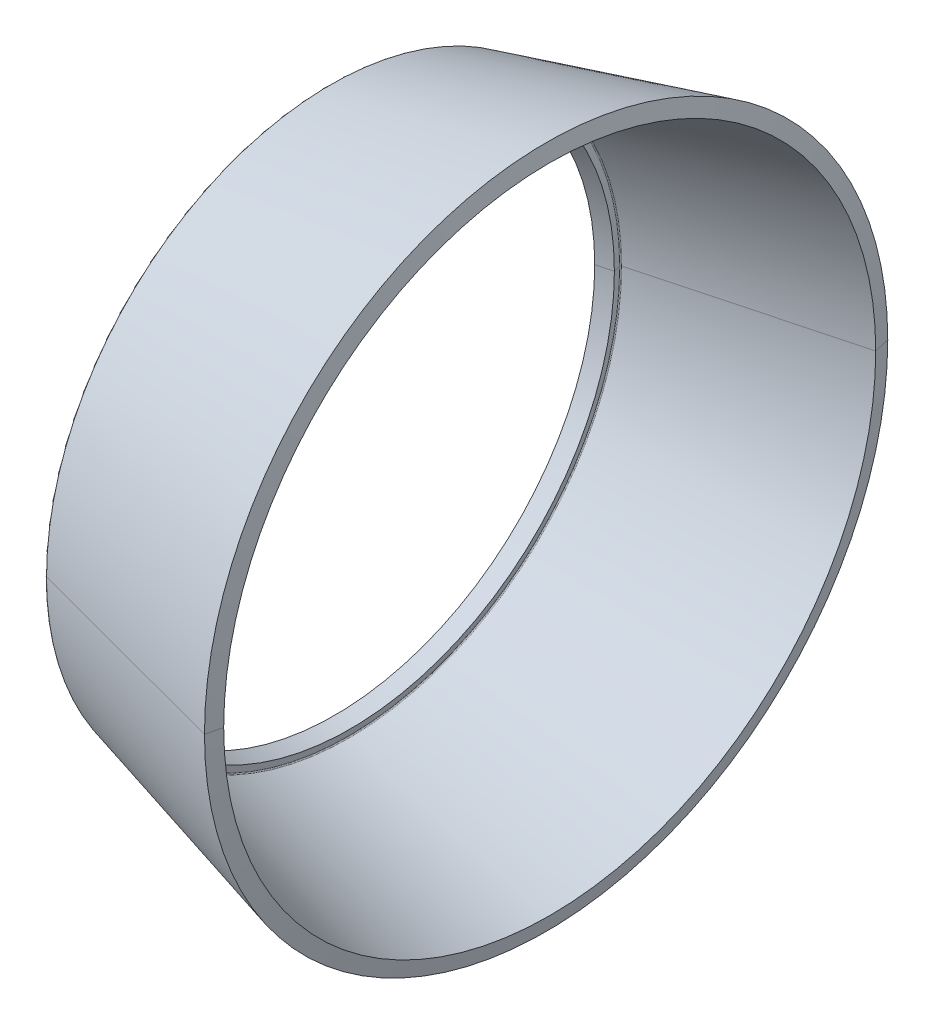
ISO-10303-21;
HEADER;
FILE_DESCRIPTION(('STEP AP214'),'2;1');
FILE_NAME('part.step','',(''),(''),'','','');
FILE_SCHEMA(('AUTOMOTIVE_DESIGN { 1 0 10303 214 1 1 1 1 }'));
ENDSEC;
DATA;
#1=APPLICATION_CONTEXT('core data for automotive mechanical design processes');
#2=APPLICATION_PROTOCOL_DEFINITION('international standard','automotive_design',2000,#1);
#3=PRODUCT_CONTEXT('',#1,'mechanical');
#4=PRODUCT('Part','Part','',(#3));
#5=PRODUCT_RELATED_PRODUCT_CATEGORY('part','',(#4));
#6=PRODUCT_DEFINITION_FORMATION('','',#4);
#7=PRODUCT_DEFINITION_CONTEXT('part definition',#1,'design');
#8=PRODUCT_DEFINITION('design','',#6,#7);
#9=PRODUCT_DEFINITION_SHAPE('','',#8);
#10=(LENGTH_UNIT() NAMED_UNIT(*) SI_UNIT(.MILLI.,.METRE.));
#11=(NAMED_UNIT(*) PLANE_ANGLE_UNIT() SI_UNIT($,.RADIAN.));
#12=(NAMED_UNIT(*) SI_UNIT($,.STERADIAN.) SOLID_ANGLE_UNIT());
#13=UNCERTAINTY_MEASURE_WITH_UNIT(LENGTH_MEASURE(1.E-05),#10,'distance_accuracy_value','');
#14=(GEOMETRIC_REPRESENTATION_CONTEXT(3) GLOBAL_UNCERTAINTY_ASSIGNED_CONTEXT((#13)) GLOBAL_UNIT_ASSIGNED_CONTEXT((#10,
#11,#12)) REPRESENTATION_CONTEXT('',''));
#15=CARTESIAN_POINT('',(0.,0.,0.));
#16=DIRECTION('',(0.,0.,1.));
#17=DIRECTION('',(1.,0.,0.));
#18=AXIS2_PLACEMENT_3D('',#15,#16,#17);
#19=CARTESIAN_POINT('',(13.309426727243,0.,0.));
#20=DIRECTION('',(1.,0.,0.));
#21=DIRECTION('',(0.,1.,0.));
#22=AXIS2_PLACEMENT_3D('',#19,#20,#21);
#23=CONICAL_SURFACE('',#22,21.309747556316,0.261083802805841);
#24=DIRECTION('',(0.966110785991032,0.,0.258127776869888));
#25=VECTOR('',#24,1.);
#26=CARTESIAN_POINT('',(-0.131131806478413,0.,17.718667170395));
#27=LINE('',#26,#25);
#28=CARTESIAN_POINT('',(-0.131131806478413,0.,17.718667170395));
#29=VERTEX_POINT('',#28);
#30=CARTESIAN_POINT('',(13.309426727243,0.,21.309747556316));
#31=VERTEX_POINT('',#30);
#32=EDGE_CURVE('E11',#29,#31,#27,.T.);
#33=ORIENTED_EDGE('',*,*,#32,.F.);
#34=CARTESIAN_POINT('',(-0.131131806478411,0.,0.));
#35=DIRECTION('',(1.,0.,0.));
#36=DIRECTION('',(0.,0.,-1.));
#37=AXIS2_PLACEMENT_3D('',#34,#35,#36);
#38=CIRCLE('',#37,17.718667170395);
#39=CARTESIAN_POINT('',(-0.131131806478407,-16.8514538724692,-5.47536927332551));
#40=VERTEX_POINT('',#39);
#41=EDGE_CURVE('E25',#29,#40,#38,.T.);
#42=ORIENTED_EDGE('',*,*,#41,.T.);
#43=CARTESIAN_POINT('',(-0.131131806478411,0.,0.));
#44=DIRECTION('',(1.,0.,0.));
#45=DIRECTION('',(0.,0.,-1.));
#46=AXIS2_PLACEMENT_3D('',#43,#44,#45);
#47=CIRCLE('',#46,17.718667170395);
#48=CARTESIAN_POINT('',(-0.131131806478411,0.,-17.718667170395));
#49=VERTEX_POINT('',#48);
#50=EDGE_CURVE('E385',#40,#49,#47,.T.);
#51=ORIENTED_EDGE('',*,*,#50,.T.);
#52=DIRECTION('',(0.966110785991032,0.,-0.258127776869888));
#53=VECTOR('',#52,1.);
#54=CARTESIAN_POINT('',(-0.131131806478409,0.,-17.718667170395));
#55=LINE('',#54,#53);
#56=CARTESIAN_POINT('',(13.309426727243,0.,-21.309747556316));
#57=VERTEX_POINT('',#56);
#58=EDGE_CURVE('E125',#49,#57,#55,.T.);
#59=ORIENTED_EDGE('',*,*,#58,.T.);
#60=CARTESIAN_POINT('',(13.309426727243,0.,0.));
#61=DIRECTION('',(1.,0.,0.));
#62=DIRECTION('',(0.,0.,-1.));
#63=AXIS2_PLACEMENT_3D('',#60,#61,#62);
#64=CIRCLE('',#63,21.309747556316);
#65=EDGE_CURVE('E377',#31,#57,#64,.T.);
#66=ORIENTED_EDGE('',*,*,#65,.F.);
#67=EDGE_LOOP('',(#33,#42,#51,#59,#66));
#68=FACE_BOUND('',#67,.T.);
#69=ADVANCED_FACE('F17',(#68),#23,.T.);
#70=CARTESIAN_POINT('',(13.533715877423,0.,0.));
#71=DIRECTION('',(-1.,0.,0.));
#72=DIRECTION('',(0.,1.,0.));
#73=AXIS2_PLACEMENT_3D('',#70,#71,#72);
#74=CONICAL_SURFACE('',#73,20.334595685589,1.34472382878342);
#75=DIRECTION('',(-0.224151698358496,0.,-0.974554265355707));
#76=VECTOR('',#75,1.);
#77=CARTESIAN_POINT('',(13.533715877423,0.,-20.334595685589));
#78=LINE('',#77,#76);
#79=CARTESIAN_POINT('',(13.533715877423,0.,-20.334595685589));
#80=VERTEX_POINT('',#79);
#81=EDGE_CURVE('E372',#80,#57,#78,.T.);
#82=ORIENTED_EDGE('',*,*,#81,.F.);
#83=CARTESIAN_POINT('',(13.533715877423,0.,0.));
#84=DIRECTION('',(1.,0.,0.));
#85=DIRECTION('',(0.,0.,-1.));
#86=AXIS2_PLACEMENT_3D('',#83,#84,#85);
#87=CIRCLE('',#86,20.334595685589);
#88=CARTESIAN_POINT('',(13.533715877423,0.,20.334595685589));
#89=VERTEX_POINT('',#88);
#90=EDGE_CURVE('E367',#89,#80,#87,.T.);
#91=ORIENTED_EDGE('',*,*,#90,.F.);
#92=DIRECTION('',(-0.224151698358495,0.,0.974554265355707));
#93=VECTOR('',#92,1.);
#94=CARTESIAN_POINT('',(13.533715877423,0.,20.334595685589));
#95=LINE('',#94,#93);
#96=EDGE_CURVE('E362',#89,#31,#95,.T.);
#97=ORIENTED_EDGE('',*,*,#96,.T.);
#98=ORIENTED_EDGE('',*,*,#65,.T.);
#99=EDGE_LOOP('',(#82,#91,#97,#98));
#100=FACE_BOUND('',#99,.T.);
#101=ADVANCED_FACE('F426',(#100),#74,.T.);
#102=CARTESIAN_POINT('',(13.533715877423,0.,0.));
#103=DIRECTION('',(-1.,0.,0.));
#104=DIRECTION('',(0.,-1.,0.));
#105=AXIS2_PLACEMENT_3D('',#102,#103,#104);
#106=CONICAL_SURFACE('',#105,20.334595685589,1.34472382878342);
#107=ORIENTED_EDGE('',*,*,#81,.T.);
#108=CARTESIAN_POINT('',(13.309426727243,0.,0.));
#109=DIRECTION('',(1.,0.,0.));
#110=DIRECTION('',(0.,0.,-1.));
#111=AXIS2_PLACEMENT_3D('',#108,#109,#110);
#112=CIRCLE('',#111,21.309747556316);
#113=EDGE_CURVE('E357',#57,#31,#112,.T.);
#114=ORIENTED_EDGE('',*,*,#113,.T.);
#115=ORIENTED_EDGE('',*,*,#96,.F.);
#116=CARTESIAN_POINT('',(13.533715877423,0.,0.));
#117=DIRECTION('',(1.,0.,0.));
#118=DIRECTION('',(0.,0.,-1.));
#119=AXIS2_PLACEMENT_3D('',#116,#117,#118);
#120=CIRCLE('',#119,20.334595685589);
#121=EDGE_CURVE('E352',#80,#89,#120,.T.);
#122=ORIENTED_EDGE('',*,*,#121,.F.);
#123=EDGE_LOOP('',(#107,#114,#115,#122));
#124=FACE_BOUND('',#123,.T.);
#125=ADVANCED_FACE('F430',(#124),#106,.T.);
#126=CARTESIAN_POINT('',(1.0287650712105,0.,0.));
#127=DIRECTION('',(1.,0.,0.));
#128=DIRECTION('',(0.,-1.,0.));
#129=AXIS2_PLACEMENT_3D('',#126,#127,#128);
#130=CONICAL_SURFACE('',#129,16.993493196848,0.261083802805781);
#131=DIRECTION('',(0.966110785991047,0.,0.25812777686983));
#132=VECTOR('',#131,1.);
#133=CARTESIAN_POINT('',(1.0287650712105,0.,16.993493196848));
#134=LINE('',#133,#132);
#135=CARTESIAN_POINT('',(1.0287650712105,0.,16.993493196848));
#136=VERTEX_POINT('',#135);
#137=EDGE_CURVE('E340',#136,#89,#134,.T.);
#138=ORIENTED_EDGE('',*,*,#137,.F.);
#139=CARTESIAN_POINT('',(1.0287650712105,0.,0.));
#140=DIRECTION('',(1.,0.,0.));
#141=DIRECTION('',(0.,0.,-1.));
#142=AXIS2_PLACEMENT_3D('',#139,#140,#141);
#143=CIRCLE('',#142,16.993493196848);
#144=CARTESIAN_POINT('',(1.0287650712105,16.1617724394797,5.25127819162109));
#145=VERTEX_POINT('',#144);
#146=EDGE_CURVE('E337',#145,#136,#143,.T.);
#147=ORIENTED_EDGE('',*,*,#146,.F.);
#148=CARTESIAN_POINT('',(1.0287650712105,0.,0.));
#149=DIRECTION('',(1.,0.,0.));
#150=DIRECTION('',(0.,0.,-1.));
#151=AXIS2_PLACEMENT_3D('',#148,#149,#150);
#152=CIRCLE('',#151,16.993493196848);
#153=CARTESIAN_POINT('',(1.0287650712105,0.,-16.993493196848));
#154=VERTEX_POINT('',#153);
#155=EDGE_CURVE('E330',#154,#145,#152,.T.);
#156=ORIENTED_EDGE('',*,*,#155,.F.);
#157=DIRECTION('',(0.966110785991047,0.,-0.25812777686983));
#158=VECTOR('',#157,1.);
#159=CARTESIAN_POINT('',(1.0287650712105,0.,-16.993493196848));
#160=LINE('',#159,#158);
#161=EDGE_CURVE('E338',#154,#80,#160,.T.);
#162=ORIENTED_EDGE('',*,*,#161,.T.);
#163=ORIENTED_EDGE('',*,*,#121,.T.);
#164=EDGE_LOOP('',(#138,#147,#156,#162,#163));
#165=FACE_BOUND('',#164,.T.);
#166=ADVANCED_FACE('F435',(#165),#130,.F.);
#167=CARTESIAN_POINT('',(1.0287650712105,0.,0.));
#168=DIRECTION('',(1.,0.,0.));
#169=DIRECTION('',(0.,1.,0.));
#170=AXIS2_PLACEMENT_3D('',#167,#168,#169);
#171=CONICAL_SURFACE('',#170,16.993493196848,0.261083802805781);
#172=ORIENTED_EDGE('',*,*,#137,.T.);
#173=ORIENTED_EDGE('',*,*,#90,.T.);
#174=ORIENTED_EDGE('',*,*,#161,.F.);
#175=CARTESIAN_POINT('',(1.0287650712105,0.,0.));
#176=DIRECTION('',(1.,0.,0.));
#177=DIRECTION('',(0.,0.,-1.));
#178=AXIS2_PLACEMENT_3D('',#175,#176,#177);
#179=CIRCLE('',#178,16.993493196848);
#180=CARTESIAN_POINT('',(1.0287650712105,-16.1617724394797,-5.25127819162109));
#181=VERTEX_POINT('',#180);
#182=EDGE_CURVE('E333',#181,#154,#179,.T.);
#183=ORIENTED_EDGE('',*,*,#182,.F.);
#184=CARTESIAN_POINT('',(1.0287650712105,0.,0.));
#185=DIRECTION('',(1.,0.,0.));
#186=DIRECTION('',(0.,0.,-1.));
#187=AXIS2_PLACEMENT_3D('',#184,#185,#186);
#188=CIRCLE('',#187,16.993493196848);
#189=EDGE_CURVE('E447',#136,#181,#188,.T.);
#190=ORIENTED_EDGE('',*,*,#189,.F.);
#191=EDGE_LOOP('',(#172,#173,#174,#183,#190));
#192=FACE_BOUND('',#191,.T.);
#193=ADVANCED_FACE('F301',(#192),#171,.F.);
#194=CARTESIAN_POINT('',(1.04597358966921,0.,0.));
#195=DIRECTION('',(1.,0.,0.));
#196=DIRECTION('',(0.,0.309016994374947,-0.951056516295154));
#197=AXIS2_PLACEMENT_3D('',#194,#195,#196);
#198=TOROIDAL_SURFACE('',#197,16.9290858111148,0.0666666666673144);
#199=CARTESIAN_POINT('',(1.04597358966921,-16.1005173755806,-5.23137521486626));
#200=DIRECTION('',(0.,0.309016994374952,-0.951056516295152));
#201=DIRECTION('',(-0.258127776878198,-0.91882595847769,-0.298544651319485));
#202=AXIS2_PLACEMENT_3D('',#199,#200,#201);
#203=CIRCLE('',#202,0.0666666666673139);
#204=CARTESIAN_POINT('',(0.981003305311402,-16.0863053133568,-5.22675743592568));
#205=VERTEX_POINT('',#204);
#206=EDGE_CURVE('E448',#181,#205,#203,.T.);
#207=ORIENTED_EDGE('',*,*,#206,.T.);
#208=CARTESIAN_POINT('',(0.981003305311402,0.,0.));
#209=DIRECTION('',(1.,0.,0.));
#210=DIRECTION('',(0.,0.,1.));
#211=AXIS2_PLACEMENT_3D('',#208,#209,#210);
#212=CIRCLE('',#211,16.914142364558);
#213=CARTESIAN_POINT('',(0.981003305311402,0.,16.914142364558));
#214=VERTEX_POINT('',#213);
#215=EDGE_CURVE('E267',#214,#205,#212,.T.);
#216=ORIENTED_EDGE('',*,*,#215,.F.);
#217=CARTESIAN_POINT('',(0.981003305311402,0.,0.));
#218=DIRECTION('',(1.,0.,0.));
#219=DIRECTION('',(0.,0.951056516295156,0.309016994374939));
#220=AXIS2_PLACEMENT_3D('',#217,#218,#219);
#221=CIRCLE('',#220,16.914142364558);
#222=CARTESIAN_POINT('',(0.981003305311402,16.0863053133568,5.22675743592568));
#223=VERTEX_POINT('',#222);
#224=EDGE_CURVE('E242',#223,#214,#221,.T.);
#225=ORIENTED_EDGE('',*,*,#224,.F.);
#226=CARTESIAN_POINT('',(1.04597358966921,16.1005173755806,5.23137521486626));
#227=DIRECTION('',(0.,-0.309016994374952,0.951056516295152));
#228=DIRECTION('',(-0.258127776878195,0.918825958477691,0.298544651319485));
#229=AXIS2_PLACEMENT_3D('',#226,#227,#228);
#230=CIRCLE('',#229,0.0666666666673139);
#231=EDGE_CURVE('E324',#145,#223,#230,.T.);
#232=ORIENTED_EDGE('',*,*,#231,.F.);
#233=ORIENTED_EDGE('',*,*,#146,.T.);
#234=ORIENTED_EDGE('',*,*,#189,.T.);
#235=EDGE_LOOP('',(#207,#216,#225,#232,#233,#234));
#236=FACE_BOUND('',#235,.T.);
#237=ADVANCED_FACE('F296',(#236),#198,.F.);
#238=CARTESIAN_POINT('',(1.04597358966921,0.,0.));
#239=DIRECTION('',(1.,0.,0.));
#240=DIRECTION('',(0.,-0.309016994374947,0.951056516295154));
#241=AXIS2_PLACEMENT_3D('',#238,#239,#240);
#242=TOROIDAL_SURFACE('',#241,16.9290858111148,0.0666666666673144);
#243=ORIENTED_EDGE('',*,*,#206,.F.);
#244=ORIENTED_EDGE('',*,*,#182,.T.);
#245=ORIENTED_EDGE('',*,*,#155,.T.);
#246=ORIENTED_EDGE('',*,*,#231,.T.);
#247=CARTESIAN_POINT('',(0.981003305311402,0.,0.));
#248=DIRECTION('',(1.,0.,0.));
#249=DIRECTION('',(0.,0.,-1.));
#250=AXIS2_PLACEMENT_3D('',#247,#248,#249);
#251=CIRCLE('',#250,16.914142364558);
#252=CARTESIAN_POINT('',(0.981003305311402,0.,-16.914142364558));
#253=VERTEX_POINT('',#252);
#254=EDGE_CURVE('E326',#253,#223,#251,.T.);
#255=ORIENTED_EDGE('',*,*,#254,.F.);
#256=CARTESIAN_POINT('',(0.981003305311402,0.,0.));
#257=DIRECTION('',(1.,0.,0.));
#258=DIRECTION('',(0.,-0.951056516295153,-0.30901699437495));
#259=AXIS2_PLACEMENT_3D('',#256,#257,#258);
#260=CIRCLE('',#259,16.914142364558);
#261=EDGE_CURVE('E256',#205,#253,#260,.T.);
#262=ORIENTED_EDGE('',*,*,#261,.F.);
#263=EDGE_LOOP('',(#243,#244,#245,#246,#255,#262));
#264=FACE_BOUND('',#263,.T.);
#265=ADVANCED_FACE('F287',(#264),#242,.F.);
#266=CARTESIAN_POINT('',(1.0787186738298,0.,0.));
#267=DIRECTION('',(-1.,0.,0.));
#268=DIRECTION('',(0.,1.,0.));
#269=AXIS2_PLACEMENT_3D('',#266,#267,#268);
#270=CONICAL_SURFACE('',#269,16.489300929592,1.34472382878407);
#271=DIRECTION('',(-0.224151698357865,0.,-0.974554265355852));
#272=VECTOR('',#271,1.);
#273=CARTESIAN_POINT('',(1.0787186738298,0.,-16.489300929592));
#274=LINE('',#273,#272);
#275=CARTESIAN_POINT('',(1.0787186738298,0.,-16.489300929592));
#276=VERTEX_POINT('',#275);
#277=EDGE_CURVE('E276',#276,#253,#274,.T.);
#278=ORIENTED_EDGE('',*,*,#277,.F.);
#279=CARTESIAN_POINT('',(1.0787186738298,0.,0.));
#280=DIRECTION('',(1.,0.,0.));
#281=DIRECTION('',(0.,0.,-1.));
#282=AXIS2_PLACEMENT_3D('',#279,#280,#281);
#283=CIRCLE('',#282,16.489300929592);
#284=CARTESIAN_POINT('',(1.0787186738298,0.,16.489300929592));
#285=VERTEX_POINT('',#284);
#286=EDGE_CURVE('E270',#285,#276,#283,.T.);
#287=ORIENTED_EDGE('',*,*,#286,.F.);
#288=DIRECTION('',(-0.224151698357865,0.,0.974554265355852));
#289=VECTOR('',#288,1.);
#290=CARTESIAN_POINT('',(1.0787186738298,0.,16.489300929592));
#291=LINE('',#290,#289);
#292=EDGE_CURVE('E268',#285,#214,#291,.T.);
#293=ORIENTED_EDGE('',*,*,#292,.T.);
#294=ORIENTED_EDGE('',*,*,#215,.T.);
#295=ORIENTED_EDGE('',*,*,#261,.T.);
#296=EDGE_LOOP('',(#278,#287,#293,#294,#295));
#297=FACE_BOUND('',#296,.T.);
#298=ADVANCED_FACE('F222',(#297),#270,.T.);
#299=CARTESIAN_POINT('',(1.0787186738298,0.,0.));
#300=DIRECTION('',(-1.,0.,0.));
#301=DIRECTION('',(0.,-1.,0.));
#302=AXIS2_PLACEMENT_3D('',#299,#300,#301);
#303=CONICAL_SURFACE('',#302,16.489300929592,1.34472382878407);
#304=ORIENTED_EDGE('',*,*,#277,.T.);
#305=ORIENTED_EDGE('',*,*,#254,.T.);
#306=ORIENTED_EDGE('',*,*,#224,.T.);
#307=ORIENTED_EDGE('',*,*,#292,.F.);
#308=CARTESIAN_POINT('',(1.0787186738298,0.,0.));
#309=DIRECTION('',(1.,0.,0.));
#310=DIRECTION('',(0.,0.,-1.));
#311=AXIS2_PLACEMENT_3D('',#308,#309,#310);
#312=CIRCLE('',#311,16.489300929592);
#313=EDGE_CURVE('E271',#276,#285,#312,.T.);
#314=ORIENTED_EDGE('',*,*,#313,.F.);
#315=EDGE_LOOP('',(#304,#305,#306,#307,#314));
#316=FACE_BOUND('',#315,.T.);
#317=ADVANCED_FACE('F217',(#316),#303,.T.);
#318=CARTESIAN_POINT('',(0.112015460084991,0.,0.));
#319=DIRECTION('',(1.,0.,0.));
#320=DIRECTION('',(0.,-1.,0.));
#321=AXIS2_PLACEMENT_3D('',#318,#319,#320);
#322=CONICAL_SURFACE('',#321,16.231014866466,0.261083802806108);
#323=DIRECTION('',(0.966110785990963,0.,0.258127776870145));
#324=VECTOR('',#323,1.);
#325=CARTESIAN_POINT('',(0.112015460084991,0.,16.231014866466));
#326=LINE('',#325,#324);
#327=CARTESIAN_POINT('',(0.112015460084993,0.,16.231014866466));
#328=VERTEX_POINT('',#327);
#329=EDGE_CURVE('E413',#328,#285,#326,.T.);
#330=ORIENTED_EDGE('',*,*,#329,.F.);
#331=CARTESIAN_POINT('',(0.112015460084991,0.,0.));
#332=DIRECTION('',(1.,0.,0.));
#333=DIRECTION('',(0.,0.,-1.));
#334=AXIS2_PLACEMENT_3D('',#331,#332,#333);
#335=CIRCLE('',#334,16.231014866466);
#336=CARTESIAN_POINT('',(0.112015460084991,0.,-16.231014866466));
#337=VERTEX_POINT('',#336);
#338=EDGE_CURVE('E408',#337,#328,#335,.T.);
#339=ORIENTED_EDGE('',*,*,#338,.F.);
#340=DIRECTION('',(0.966110785990963,0.,-0.258127776870145));
#341=VECTOR('',#340,1.);
#342=CARTESIAN_POINT('',(0.112015460084991,0.,-16.231014866466));
#343=LINE('',#342,#341);
#344=EDGE_CURVE('E399',#337,#276,#343,.T.);
#345=ORIENTED_EDGE('',*,*,#344,.T.);
#346=ORIENTED_EDGE('',*,*,#313,.T.);
#347=EDGE_LOOP('',(#330,#339,#345,#346));
#348=FACE_BOUND('',#347,.T.);
#349=ADVANCED_FACE('F213',(#348),#322,.F.);
#350=CARTESIAN_POINT('',(0.112015460084991,0.,0.));
#351=DIRECTION('',(1.,0.,0.));
#352=DIRECTION('',(0.,1.,0.));
#353=AXIS2_PLACEMENT_3D('',#350,#351,#352);
#354=CONICAL_SURFACE('',#353,16.231014866466,0.261083802806108);
#355=ORIENTED_EDGE('',*,*,#329,.T.);
#356=ORIENTED_EDGE('',*,*,#286,.T.);
#357=ORIENTED_EDGE('',*,*,#344,.F.);
#358=CARTESIAN_POINT('',(0.112015460084991,0.,0.));
#359=DIRECTION('',(1.,0.,0.));
#360=DIRECTION('',(0.,0.,-1.));
#361=AXIS2_PLACEMENT_3D('',#358,#359,#360);
#362=CIRCLE('',#361,16.231014866466);
#363=EDGE_CURVE('E398',#328,#337,#362,.T.);
#364=ORIENTED_EDGE('',*,*,#363,.F.);
#365=EDGE_LOOP('',(#355,#356,#357,#364));
#366=FACE_BOUND('',#365,.T.);
#367=ADVANCED_FACE('F209',(#366),#354,.F.);
#368=CARTESIAN_POINT('',(-0.202774455327008,0.,0.));
#369=DIRECTION('',(-1.,0.,0.));
#370=DIRECTION('',(0.,1.,0.));
#371=AXIS2_PLACEMENT_3D('',#368,#369,#370);
#372=CONICAL_SURFACE('',#371,17.59964092196,1.34472382878409);
#373=DIRECTION('',(-0.224151698357842,0.,-0.974554265355858));
#374=VECTOR('',#373,1.);
#375=CARTESIAN_POINT('',(0.112015460084993,0.,-16.231014866466));
#376=LINE('',#375,#374);
#377=CARTESIAN_POINT('',(-0.202774455327008,0.,-17.59964092196));
#378=VERTEX_POINT('',#377);
#379=EDGE_CURVE('E397',#337,#378,#376,.T.);
#380=ORIENTED_EDGE('',*,*,#379,.T.);
#381=CARTESIAN_POINT('',(-0.202774455327014,-16.7382531832849,-5.4385881397824));
#382=CARTESIAN_POINT('',(-0.202774455327014,-16.667064582229,-5.65769222576088));
#383=CARTESIAN_POINT('',(-0.202774455327014,-16.5915692757817,-5.87539679921745));
#384=CARTESIAN_POINT('',(-0.202774455327014,-16.4320919808777,-6.30767504384136));
#385=CARTESIAN_POINT('',(-0.202774455327014,-16.3481099924211,-6.52224871500871));
#386=CARTESIAN_POINT('',(-0.202774455327014,-16.1717860622727,-6.94793327780877));
#387=CARTESIAN_POINT('',(-0.202774455327014,-16.0794441205808,-7.15904416944149));
#388=CARTESIAN_POINT('',(-0.202774455327014,-15.8865434095202,-7.57747792884));
#389=CARTESIAN_POINT('',(-0.202774455327014,-15.7859846401515,-7.7848007966058));
#390=CARTESIAN_POINT('',(-0.202774455327014,-15.5768051295264,-8.19533875818858));
#391=CARTESIAN_POINT('',(-0.202774455327014,-15.4681843882702,-8.39855385200557));
#392=CARTESIAN_POINT('',(-0.202774455327014,-15.24304847238,-8.80056294237182));
#393=CARTESIAN_POINT('',(-0.202774455327014,-15.1265332977461,-8.9993569389211));
#394=CARTESIAN_POINT('',(-0.202774455327014,-14.8857881587999,-9.39221730355924));
#395=CARTESIAN_POINT('',(-0.202774455327014,-14.7615581944875,-9.5862836716481));
#396=CARTESIAN_POINT('',(-0.202774455327014,-14.5055750336047,-9.96938954450116));
#397=CARTESIAN_POINT('',(-0.202774455327014,-14.3738218370341,-10.1584290492654));
#398=CARTESIAN_POINT('',(-0.202774455327014,-14.1029953644907,-10.531189709877));
#399=CARTESIAN_POINT('',(-0.202774455327014,-13.9639220885179,-10.7149108657245));
#400=CARTESIAN_POINT('',(-0.202774455327014,-13.6786698983557,-11.0767515438979));
#401=CARTESIAN_POINT('',(-0.202774455327014,-13.5324909841662,-11.2548710662238));
#402=CARTESIAN_POINT('',(-0.202774455327014,-13.2332529147875,-11.6052338299341));
#403=CARTESIAN_POINT('',(-0.202774455327014,-13.0801937595982,-11.7774770713183));
#404=CARTESIAN_POINT('',(-0.202774455327014,-12.7674312143631,-12.1158216865587));
#405=CARTESIAN_POINT('',(-0.202774455327014,-12.6077278243172,-12.2819230604148));
#406=CARTESIAN_POINT('',(-0.202774455327014,-12.2819230604152,-12.6077278243176));
#407=CARTESIAN_POINT('',(-0.202774455327014,-12.1158216865593,-12.7674312143643));
#408=CARTESIAN_POINT('',(-0.202774455327014,-11.7774770713178,-13.080193759597));
#409=CARTESIAN_POINT('',(-0.202774455327014,-11.6052338299324,-13.2332529147829));
#410=CARTESIAN_POINT('',(-0.202774455327014,-11.2548710662255,-13.5324909841706));
#411=CARTESIAN_POINT('',(-0.202774455327014,-11.0767515439041,-13.6786698983724));
#412=CARTESIAN_POINT('',(-0.202774455327014,-10.7149108657183,-13.9639220885012));
#413=CARTESIAN_POINT('',(-0.202774455327014,-10.531189709854,-14.1029953644283));
#414=CARTESIAN_POINT('',(-0.202774455327014,-10.1584290492884,-14.3738218370965));
#415=CARTESIAN_POINT('',(-0.202774455327014,-9.96938954458719,-14.5055750338377));
#416=CARTESIAN_POINT('',(-0.202774455327014,-9.58628367156217,-14.7615581942544));
#417=CARTESIAN_POINT('',(-0.202774455327014,-9.39221730323839,-14.88578815793));
#418=CARTESIAN_POINT('',(-0.202774455327014,-8.99935693924205,-15.1265332986159));
#419=CARTESIAN_POINT('',(-0.202774455327014,-8.80056294356948,-15.2430484756262));
#420=CARTESIAN_POINT('',(-0.202774455327014,-8.39855385080802,-15.468184385024));
#421=CARTESIAN_POINT('',(-0.202774455327014,-8.19533875371913,-15.5768051174116));
#422=CARTESIAN_POINT('',(-0.202774455327014,-7.78480080107535,-15.7859846522662));
#423=CARTESIAN_POINT('',(-0.202774455327014,-7.57747794552047,-15.8865434547333));
#424=CARTESIAN_POINT('',(-0.202774455327014,-7.15904415276113,-16.0794440753677));
#425=CARTESIAN_POINT('',(-0.202774455327014,-6.94793321555667,-16.1717858935351));
#426=CARTESIAN_POINT('',(-0.202774455327014,-6.52224877726091,-16.3481101611587));
#427=CARTESIAN_POINT('',(-0.202774455327014,-6.30767527616961,-16.4320926106149));
#428=CARTESIAN_POINT('',(-0.202774455327014,-5.87539656688931,-16.5915686460444));
#429=CARTESIAN_POINT('',(-0.202774455327014,-5.65769135870032,-16.6670622320178));
#430=CARTESIAN_POINT('',(-0.202774455327014,-5.2194849208646,-16.809444134552));
#431=CARTESIAN_POINT('',(-0.202774455327014,-4.99898369121788,-16.8763324511128));
#432=CARTESIAN_POINT('',(-0.202774455327014,-4.55552520742341,-17.0014006789758));
#433=CARTESIAN_POINT('',(-0.202774455327014,-4.33256795327566,-17.0595805902781));
#434=CARTESIAN_POINT('',(-0.202774455327014,-3.88454120424493,-17.1671422943498));
#435=CARTESIAN_POINT('',(-0.202774455327014,-3.65947170936195,-17.2165240871192));
#436=CARTESIAN_POINT('',(-0.202774455327014,-3.20756752030499,-17.3064134261622));
#437=CARTESIAN_POINT('',(-0.202774455327014,-2.98073282613103,-17.3469209724358));
#438=CARTESIAN_POINT('',(-0.202774455327014,-2.52564799892302,-17.4189993021261));
#439=CARTESIAN_POINT('',(-0.202774455327014,-2.29739786588898,-17.4505700855427));
#440=CARTESIAN_POINT('',(-0.202774455327014,-1.83983411443041,-17.5047264211205));
#441=CARTESIAN_POINT('',(-0.202774455327014,-1.61052049600587,-17.5273119732817));
#442=CARTESIAN_POINT('',(-0.202774455327014,-1.15118332773777,-17.5634622318799));
#443=CARTESIAN_POINT('',(-0.202774455327014,-0.921159777894216,-17.5770269383168));
#444=CARTESIAN_POINT('',(-0.202774455327014,-0.460757542149747,-17.595117534949));
#445=CARTESIAN_POINT('',(-0.202774455327014,-0.230378856248834,-17.5996434251442));
#446=CARTESIAN_POINT('',(-0.202774455327014,0.,-17.59964092196));
#447=B_SPLINE_CURVE_WITH_KNOTS('',3,(#381,#382,#383,#384,#385,#386,#387,#388,#389,#390,#391,
#392,#393,#394,#395,#396,#397,#398,#399,#400,#401,#402,#403,#404,#405,#406,#407,#408,#409,#410,
#411,#412,#413,#414,#415,#416,#417,#418,#419,#420,#421,#422,#423,#424,#425,#426,#427,#428,#429,
#430,#431,#432,#433,#434,#435,#436,#437,#438,#439,#440,#441,#442,#443,#444,#445,#446),
.UNSPECIFIED.,.F.,.F.,(4,2,2,2,2,2,2,2,2,2,2,2,2,2,2,2,2,2,2,2,2,2,2,2,2,2,2,2,2,2,2,2,4),(0.,
0.6910918745585,1.382183749117,2.07327562367551,2.764367498234,3.4554593727925,4.14655124735101,
4.83764312190951,5.52873499646801,6.2198268710265,6.91091874558501,7.60201062014351,
8.29310249470201,8.98419436926051,9.67528624381901,10.3663781183775,11.057469992936,
11.7485618674945,12.439653742053,13.1307456166115,13.82183749117,14.5129293657285,
15.204021240287,15.8951131148455,16.586204989404,17.2772968639625,17.968388738521,
18.6594806130795,19.350572487638,20.0416643621965,20.732756236755,21.4238481113135,
22.114939985872),.UNSPECIFIED.);
#448=CARTESIAN_POINT('',(-0.202774455327014,-16.7382531832849,-5.43858813978241));
#449=VERTEX_POINT('',#448);
#450=EDGE_CURVE('E161',#449,#378,#447,.T.);
#451=ORIENTED_EDGE('',*,*,#450,.F.);
#452=CARTESIAN_POINT('',(-0.202774455327008,0.,0.));
#453=DIRECTION('',(1.,0.,0.));
#454=DIRECTION('',(0.,0.,-1.));
#455=AXIS2_PLACEMENT_3D('',#452,#453,#454);
#456=CIRCLE('',#455,17.59964092196);
#457=CARTESIAN_POINT('',(-0.202774455327006,0.,17.59964092196));
#458=VERTEX_POINT('',#457);
#459=EDGE_CURVE('E189',#458,#449,#456,.T.);
#460=ORIENTED_EDGE('',*,*,#459,.F.);
#461=DIRECTION('',(-0.224151698357842,0.,0.974554265355858));
#462=VECTOR('',#461,1.);
#463=CARTESIAN_POINT('',(0.112015460084993,0.,16.231014866466));
#464=LINE('',#463,#462);
#465=EDGE_CURVE('E187',#328,#458,#464,.T.);
#466=ORIENTED_EDGE('',*,*,#465,.F.);
#467=ORIENTED_EDGE('',*,*,#363,.T.);
#468=EDGE_LOOP('',(#380,#451,#460,#466,#467));
#469=FACE_BOUND('',#468,.T.);
#470=ADVANCED_FACE('F200',(#469),#372,.F.);
#471=CARTESIAN_POINT('',(-0.202774455327008,0.,0.));
#472=DIRECTION('',(-1.,0.,0.));
#473=DIRECTION('',(0.,-1.,0.));
#474=AXIS2_PLACEMENT_3D('',#471,#472,#473);
#475=CONICAL_SURFACE('',#474,17.59964092196,1.34472382878409);
#476=ORIENTED_EDGE('',*,*,#379,.F.);
#477=ORIENTED_EDGE('',*,*,#338,.T.);
#478=ORIENTED_EDGE('',*,*,#465,.T.);
#479=CARTESIAN_POINT('',(-0.202774455327014,16.7382531832849,5.43858813978241));
#480=CARTESIAN_POINT('',(-0.202774455327014,16.667064582229,5.65769222576088));
#481=CARTESIAN_POINT('',(-0.202774455327014,16.5915692757817,5.87539679921745));
#482=CARTESIAN_POINT('',(-0.202774455327014,16.4320919808777,6.30767504384137));
#483=CARTESIAN_POINT('',(-0.202774455327014,16.3481099924211,6.52224871500871));
#484=CARTESIAN_POINT('',(-0.202774455327014,16.1717860622727,6.94793327780878));
#485=CARTESIAN_POINT('',(-0.202774455327014,16.0794441205808,7.1590441694415));
#486=CARTESIAN_POINT('',(-0.202774455327014,15.8865434095202,7.57747792884001));
#487=CARTESIAN_POINT('',(-0.202774455327014,15.7859846401515,7.78480079660581));
#488=CARTESIAN_POINT('',(-0.202774455327014,15.5768051295264,8.19533875818859));
#489=CARTESIAN_POINT('',(-0.202774455327014,15.4681843882702,8.39855385200558));
#490=CARTESIAN_POINT('',(-0.202774455327014,15.24304847238,8.80056294237184));
#491=CARTESIAN_POINT('',(-0.202774455327014,15.1265332977461,8.99935693892111));
#492=CARTESIAN_POINT('',(-0.202774455327014,14.8857881587999,9.39221730355925));
#493=CARTESIAN_POINT('',(-0.202774455327014,14.7615581944875,9.58628367164812));
#494=CARTESIAN_POINT('',(-0.202774455327014,14.5055750336047,9.96938954450118));
#495=CARTESIAN_POINT('',(-0.202774455327014,14.3738218370341,10.1584290492654));
#496=CARTESIAN_POINT('',(-0.202774455327014,14.1029953644907,10.531189709877));
#497=CARTESIAN_POINT('',(-0.202774455327014,13.9639220885179,10.7149108657245));
#498=CARTESIAN_POINT('',(-0.202774455327014,13.6786698983557,11.0767515438979));
#499=CARTESIAN_POINT('',(-0.202774455327014,13.5324909841662,11.2548710662238));
#500=CARTESIAN_POINT('',(-0.202774455327014,13.2332529147875,11.6052338299341));
#501=CARTESIAN_POINT('',(-0.202774455327014,13.0801937595982,11.7774770713183));
#502=CARTESIAN_POINT('',(-0.202774455327014,12.7674312143631,12.1158216865587));
#503=CARTESIAN_POINT('',(-0.202774455327014,12.6077278243171,12.2819230604148));
#504=CARTESIAN_POINT('',(-0.202774455327014,12.2819230604152,12.6077278243176));
#505=CARTESIAN_POINT('',(-0.202774455327014,12.1158216865592,12.7674312143643));
#506=CARTESIAN_POINT('',(-0.202774455327014,11.7774770713178,13.080193759597));
#507=CARTESIAN_POINT('',(-0.202774455327014,11.6052338299324,13.233252914783));
#508=CARTESIAN_POINT('',(-0.202774455327014,11.2548710662255,13.5324909841707));
#509=CARTESIAN_POINT('',(-0.202774455327014,11.0767515439041,13.6786698983724));
#510=CARTESIAN_POINT('',(-0.202774455327014,10.7149108657183,13.9639220885012));
#511=CARTESIAN_POINT('',(-0.202774455327014,10.531189709854,14.1029953644283));
#512=CARTESIAN_POINT('',(-0.202774455327014,10.1584290492884,14.3738218370965));
#513=CARTESIAN_POINT('',(-0.202774455327014,9.96938954458716,14.5055750338377));
#514=CARTESIAN_POINT('',(-0.202774455327014,9.58628367156213,14.7615581942545));
#515=CARTESIAN_POINT('',(-0.202774455327014,9.39221730323835,14.8857881579301));
#516=CARTESIAN_POINT('',(-0.202774455327014,8.999356939242,15.1265332986159));
#517=CARTESIAN_POINT('',(-0.202774455327014,8.80056294356944,15.2430484756262));
#518=CARTESIAN_POINT('',(-0.202774455327014,8.39855385080798,15.468184385024));
#519=CARTESIAN_POINT('',(-0.202774455327014,8.19533875371909,15.5768051174116));
#520=CARTESIAN_POINT('',(-0.202774455327014,7.78480080107531,15.7859846522663));
#521=CARTESIAN_POINT('',(-0.202774455327014,7.57747794552042,15.8865434547333));
#522=CARTESIAN_POINT('',(-0.202774455327014,7.15904415276108,16.0794440753678));
#523=CARTESIAN_POINT('',(-0.202774455327014,6.94793321555663,16.1717858935351));
#524=CARTESIAN_POINT('',(-0.202774455327014,6.52224877726087,16.3481101611587));
#525=CARTESIAN_POINT('',(-0.202774455327014,6.30767527616956,16.4320926106149));
#526=CARTESIAN_POINT('',(-0.202774455327014,5.87539656688926,16.5915686460445));
#527=CARTESIAN_POINT('',(-0.202774455327014,5.65769135870026,16.6670622320178));
#528=CARTESIAN_POINT('',(-0.202774455327014,5.21948492086455,16.809444134552));
#529=CARTESIAN_POINT('',(-0.202774455327014,4.99898369121783,16.8763324511128));
#530=CARTESIAN_POINT('',(-0.202774455327014,4.55552520742336,17.0014006789758));
#531=CARTESIAN_POINT('',(-0.202774455327014,4.3325679532756,17.0595805902781));
#532=CARTESIAN_POINT('',(-0.202774455327014,3.88454120424486,17.1671422943498));
#533=CARTESIAN_POINT('',(-0.202774455327014,3.65947170936188,17.2165240871192));
#534=CARTESIAN_POINT('',(-0.202774455327014,3.20756752030493,17.3064134261622));
#535=CARTESIAN_POINT('',(-0.202774455327014,2.98073282613097,17.3469209724358));
#536=CARTESIAN_POINT('',(-0.202774455327014,2.52564799892297,17.4189993021261));
#537=CARTESIAN_POINT('',(-0.202774455327014,2.29739786588893,17.4505700855427));
#538=CARTESIAN_POINT('',(-0.202774455327014,1.83983411443034,17.5047264211205));
#539=CARTESIAN_POINT('',(-0.202774455327014,1.6105204960058,17.5273119732817));
#540=CARTESIAN_POINT('',(-0.202774455327014,1.1511833277377,17.5634622318799));
#541=CARTESIAN_POINT('',(-0.202774455327014,0.921159777894148,17.5770269383168));
#542=CARTESIAN_POINT('',(-0.202774455327014,0.460757542149676,17.595117534949));
#543=CARTESIAN_POINT('',(-0.202774455327014,0.23037885624876,17.5996434251442));
#544=CARTESIAN_POINT('',(-0.202774455327014,0.,17.59964092196));
#545=B_SPLINE_CURVE_WITH_KNOTS('',3,(#479,#480,#481,#482,#483,#484,#485,#486,#487,#488,#489,
#490,#491,#492,#493,#494,#495,#496,#497,#498,#499,#500,#501,#502,#503,#504,#505,#506,#507,#508,
#509,#510,#511,#512,#513,#514,#515,#516,#517,#518,#519,#520,#521,#522,#523,#524,#525,#526,#527,
#528,#529,#530,#531,#532,#533,#534,#535,#536,#537,#538,#539,#540,#541,#542,#543,#544),
.UNSPECIFIED.,.F.,.F.,(4,2,2,2,2,2,2,2,2,2,2,2,2,2,2,2,2,2,2,2,2,2,2,2,2,2,2,2,2,2,2,2,4),(0.,
0.691091874558504,1.38218374911701,2.07327562367551,2.76436749823401,3.45545937279251,
4.14655124735102,4.83764312190952,5.52873499646802,6.21982687102653,6.91091874558503,
7.60201062014353,8.29310249470203,8.98419436926054,9.67528624381904,10.3663781183775,
11.057469992936,11.7485618674946,12.4396537420531,13.1307456166116,13.8218374911701,
14.5129293657286,15.2040212402871,15.8951131148456,16.5862049894041,17.2772968639626,
17.9683887385211,18.6594806130796,19.3505724876381,20.0416643621966,20.7327562367551,
21.4238481113136,22.1149399858721),.UNSPECIFIED.);
#546=CARTESIAN_POINT('',(-0.202774455327014,16.7382531832849,5.43858813978241));
#547=VERTEX_POINT('',#546);
#548=EDGE_CURVE('E186',#547,#458,#545,.T.);
#549=ORIENTED_EDGE('',*,*,#548,.F.);
#550=CARTESIAN_POINT('',(-0.202774455327014,0.,-17.59964092196));
#551=CARTESIAN_POINT('',(-0.202774455327014,0.345568864899183,-17.5996535821117));
#552=CARTESIAN_POINT('',(-0.202774455327014,0.691136436635035,-17.5894635491097));
#553=CARTESIAN_POINT('',(-0.202774455327014,1.38107357346119,-17.5487690188749));
#554=CARTESIAN_POINT('',(-0.202774455327014,1.72544313855149,-17.5182645216419));
#555=CARTESIAN_POINT('',(-0.202774455327014,2.41178884176773,-17.4370319850213));
#556=CARTESIAN_POINT('',(-0.202774455327014,2.75376497989365,-17.3863039456335));
#557=CARTESIAN_POINT('',(-0.202774455327014,3.4341378246283,-17.2648042792055));
#558=CARTESIAN_POINT('',(-0.202774455327014,3.77253453123702,-17.1940326521651));
#559=CARTESIAN_POINT('',(-0.202774455327014,4.4445746262834,-17.0326902324628));
#560=CARTESIAN_POINT('',(-0.202774455327014,4.77821801472106,-16.9421194398007));
#561=CARTESIAN_POINT('',(-0.202774455327014,5.43959415493006,-16.7414931454528));
#562=CARTESIAN_POINT('',(-0.202774455327014,5.76732690670141,-16.6314376437669));
#563=CARTESIAN_POINT('',(-0.202774455327014,6.41574493635734,-16.3922236128925));
#564=CARTESIAN_POINT('',(-0.202774455327014,6.73643021424193,-16.2630650837039));
#565=CARTESIAN_POINT('',(-0.202774455327014,7.36964091077753,-15.9860930408675));
#566=CARTESIAN_POINT('',(-0.202774455327014,7.68216632942856,-15.8382795272195));
#567=CARTESIAN_POINT('',(-0.202774455327014,8.29797322536579,-15.5245102424584));
#568=CARTESIAN_POINT('',(-0.202774455327014,8.60125470265199,-15.3585544713451));
#569=CARTESIAN_POINT('',(-0.202774455327014,9.19752169933592,-15.0090763371285));
#570=CARTESIAN_POINT('',(-0.202774455327014,9.49050721873366,-14.825553974025));
#571=CARTESIAN_POINT('',(-0.202774455327014,10.0651659974156,-14.4415792540672));
#572=CARTESIAN_POINT('',(-0.202774455327014,10.3468392566998,-14.2411268972128));
#573=CARTESIAN_POINT('',(-0.202774455327014,10.8978964526966,-13.8239875149113));
#574=CARTESIAN_POINT('',(-0.202774455327014,11.1672803894092,-13.6073004894643));
#575=CARTESIAN_POINT('',(-0.202774455327014,11.6928245067487,-13.1584434094894));
#576=CARTESIAN_POINT('',(-0.202774455327014,11.9489846873756,-12.9262733549614));
#577=CARTESIAN_POINT('',(-0.202774455327014,12.4471927293274,-12.4472555635881));
#578=CARTESIAN_POINT('',(-0.202774455327014,12.6892405906523,-12.2004078267428));
#579=CARTESIAN_POINT('',(-0.202774455327014,13.158384383309,-11.6928909311343));
#580=CARTESIAN_POINT('',(-0.202774455327014,13.3854803146408,-11.432221772371));
#581=CARTESIAN_POINT('',(-0.202774455327014,13.8239325015705,-10.8979662367953));
#582=CARTESIAN_POINT('',(-0.202774455327014,14.0352887571685,-10.6243798599828));
#583=CARTESIAN_POINT('',(-0.202774455327014,14.4415284443563,-10.0652388991597));
#584=CARTESIAN_POINT('',(-0.202774455327014,14.6364118759461,-9.77968431514896));
#585=CARTESIAN_POINT('',(-0.202774455327014,15.00902990744,-9.19759746585376));
#586=CARTESIAN_POINT('',(-0.202774455327014,15.1867645073441,-8.90106520056927));
#587=CARTESIAN_POINT('',(-0.202774455327014,15.5244683533061,-8.29805159380822));
#588=CARTESIAN_POINT('',(-0.202774455327014,15.684437599364,-7.99157025233168));
#589=CARTESIAN_POINT('',(-0.202774455327014,15.9860558395735,-7.36972160942048));
#590=CARTESIAN_POINT('',(-0.202774455327014,16.127704833725,-7.05435430798584));
#591=CARTESIAN_POINT('',(-0.202774455327014,16.3921912209688,-6.41582768483174));
#592=CARTESIAN_POINT('',(-0.202774455327014,16.5150286140609,-6.09266836311228));
#593=CARTESIAN_POINT('',(-0.202774455327014,16.7414657033664,-5.43967866785397));
#594=CARTESIAN_POINT('',(-0.202774455327014,16.8450653995798,-5.10984829431512));
#595=CARTESIAN_POINT('',(-0.202774455327014,17.0326677305088,-4.44466060432614));
#596=CARTESIAN_POINT('',(-0.202774455327014,17.1166703652245,-4.109303287876));
#597=CARTESIAN_POINT('',(-0.202774455327014,17.2647871869137,-3.43422499259261));
#598=CARTESIAN_POINT('',(-0.202774455327014,17.3289013738872,-3.09450401375935));
#599=CARTESIAN_POINT('',(-0.202774455327014,17.4370189006747,-2.41187681129469));
#600=CARTESIAN_POINT('',(-0.202774455327014,17.4810222404887,-2.06897058766328));
#601=CARTESIAN_POINT('',(-0.202774455327014,17.5487654404104,-1.38116236033209));
#602=CARTESIAN_POINT('',(-0.202774455327014,17.5725053005181,-1.03626035663231));
#603=CARTESIAN_POINT('',(-0.202774455327014,17.5996391727477,-0.345656963411639));
#604=CARTESIAN_POINT('',(-0.202774455327014,17.6030331848695,4.44261092461288E-05));
#605=CARTESIAN_POINT('',(-0.202774455327014,17.5894636624506,0.691047448449147));
#606=CARTESIAN_POINT('',(-0.202774455327014,17.5725001279098,1.03634908126816));
#607=CARTESIAN_POINT('',(-0.202774455327014,17.5182740772519,1.72535474247525));
#608=CARTESIAN_POINT('',(-0.202774455327014,17.4810115611348,2.06905877086332));
#609=CARTESIAN_POINT('',(-0.202774455327014,17.3863178390847,2.75367726009563));
#610=CARTESIAN_POINT('',(-0.202774455327014,17.3288866331516,3.09459172093988));
#611=CARTESIAN_POINT('',(-0.202774455327014,17.1940508801298,3.77244750872683));
#612=CARTESIAN_POINT('',(-0.202774455327014,17.1166463330411,4.10938883566953));
#613=CARTESIAN_POINT('',(-0.202774455327014,16.9421468308689,4.77813334690275));
#614=CARTESIAN_POINT('',(-0.202774455327014,16.8450518757854,5.10993653119326));
#615=CARTESIAN_POINT('',(-0.202774455327014,16.7382531832849,5.43858813978235));
#616=B_SPLINE_CURVE_WITH_KNOTS('',3,(#550,#551,#552,#553,#554,#555,#556,#557,#558,#559,#560,
#561,#562,#563,#564,#565,#566,#567,#568,#569,#570,#571,#572,#573,#574,#575,#576,#577,#578,#579,
#580,#581,#582,#583,#584,#585,#586,#587,#588,#589,#590,#591,#592,#593,#594,#595,#596,#597,#598,
#599,#600,#601,#602,#603,#604,#605,#606,#607,#608,#609,#610,#611,#612,#613,#614,#615),
.UNSPECIFIED.,.F.,.F.,(4,2,2,2,2,2,2,2,2,2,2,2,2,2,2,2,2,2,2,2,2,2,2,2,2,2,2,2,2,2,2,2,4),(0.,
1.03655454994364,2.07310909988728,3.10966364983092,4.14621819977456,5.1827727497182,
6.21932729966183,7.25588184960548,8.29243639954912,9.32899094949276,10.3655454994364,
11.40210004938,12.4386545993237,13.4752091492673,14.511763699211,15.5483182491546,
16.5848727990982,17.6214273490419,18.6579818989855,19.6945364489292,20.7310909988728,
21.7676455488164,22.8042000987601,23.8407546487037,24.8773091986473,25.913863748591,
26.9504182985346,27.9869728484783,29.0235273984219,30.0600819483655,31.0966364983092,
32.1331910482528,33.1697455981965),.UNSPECIFIED.);
#617=EDGE_CURVE('E113',#378,#547,#616,.T.);
#618=ORIENTED_EDGE('',*,*,#617,.F.);
#619=EDGE_LOOP('',(#476,#477,#478,#549,#618));
#620=FACE_BOUND('',#619,.T.);
#621=ADVANCED_FACE('F147',(#620),#475,.F.);
#622=CARTESIAN_POINT('',(-0.105319028791829,0.,0.));
#623=DIRECTION('',(1.,0.,0.));
#624=DIRECTION('',(0.,-0.309016994374947,0.951056516295154));
#625=AXIS2_PLACEMENT_3D('',#622,#623,#624);
#626=TOROIDAL_SURFACE('',#625,17.6220560917961,0.0999999999996799);
#627=CARTESIAN_POINT('',(-0.105319028791829,-16.7595712766214,-5.44551480819356));
#628=DIRECTION('',(0.,0.309016994374944,-0.951056516295155));
#629=DIRECTION('',(-0.258127776866599,-0.91882595848064,-0.298544651320435));
#630=AXIS2_PLACEMENT_3D('',#627,#628,#629);
#631=CIRCLE('',#630,0.0999999999996812);
#632=EDGE_CURVE('E117',#40,#449,#631,.T.);
#633=ORIENTED_EDGE('',*,*,#632,.T.);
#634=ORIENTED_EDGE('',*,*,#450,.T.);
#635=ORIENTED_EDGE('',*,*,#617,.T.);
#636=CARTESIAN_POINT('',(-0.105319028791829,16.7595712766214,5.44551480819356));
#637=DIRECTION('',(0.,-0.309016994374944,0.951056516295155));
#638=DIRECTION('',(-0.258127776866597,0.918825958480641,0.298544651320435));
#639=AXIS2_PLACEMENT_3D('',#636,#637,#638);
#640=CIRCLE('',#639,0.0999999999996812);
#641=CARTESIAN_POINT('',(-0.131131806478407,16.8514538724692,5.47536927332551));
#642=VERTEX_POINT('',#641);
#643=EDGE_CURVE('E103',#642,#547,#640,.T.);
#644=ORIENTED_EDGE('',*,*,#643,.F.);
#645=CARTESIAN_POINT('',(-0.131131806478411,0.,0.));
#646=DIRECTION('',(1.,0.,0.));
#647=DIRECTION('',(0.,0.,-1.));
#648=AXIS2_PLACEMENT_3D('',#645,#646,#647);
#649=CIRCLE('',#648,17.718667170395);
#650=EDGE_CURVE('E109',#49,#642,#649,.T.);
#651=ORIENTED_EDGE('',*,*,#650,.F.);
#652=ORIENTED_EDGE('',*,*,#50,.F.);
#653=EDGE_LOOP('',(#633,#634,#635,#644,#651,#652));
#654=FACE_BOUND('',#653,.T.);
#655=ADVANCED_FACE('F106',(#654),#626,.T.);
#656=CARTESIAN_POINT('',(13.309426727243,0.,0.));
#657=DIRECTION('',(1.,0.,0.));
#658=DIRECTION('',(0.,-1.,0.));
#659=AXIS2_PLACEMENT_3D('',#656,#657,#658);
#660=CONICAL_SURFACE('',#659,21.309747556316,0.261083802805841);
#661=ORIENTED_EDGE('',*,*,#32,.T.);
#662=ORIENTED_EDGE('',*,*,#113,.F.);
#663=ORIENTED_EDGE('',*,*,#58,.F.);
#664=ORIENTED_EDGE('',*,*,#650,.T.);
#665=CARTESIAN_POINT('',(-0.131131806478411,0.,0.));
#666=DIRECTION('',(1.,0.,0.));
#667=DIRECTION('',(0.,0.,-1.));
#668=AXIS2_PLACEMENT_3D('',#665,#666,#667);
#669=CIRCLE('',#668,17.718667170395);
#670=EDGE_CURVE('E119',#642,#29,#669,.T.);
#671=ORIENTED_EDGE('',*,*,#670,.T.);
#672=EDGE_LOOP('',(#661,#662,#663,#664,#671));
#673=FACE_BOUND('',#672,.T.);
#674=ADVANCED_FACE('F123',(#673),#660,.T.);
#675=CARTESIAN_POINT('',(-0.105319028791829,0.,0.));
#676=DIRECTION('',(1.,0.,0.));
#677=DIRECTION('',(0.,0.309016994374947,-0.951056516295154));
#678=AXIS2_PLACEMENT_3D('',#675,#676,#677);
#679=TOROIDAL_SURFACE('',#678,17.6220560917961,0.0999999999996799);
#680=ORIENTED_EDGE('',*,*,#632,.F.);
#681=ORIENTED_EDGE('',*,*,#41,.F.);
#682=ORIENTED_EDGE('',*,*,#670,.F.);
#683=ORIENTED_EDGE('',*,*,#643,.T.);
#684=ORIENTED_EDGE('',*,*,#548,.T.);
#685=ORIENTED_EDGE('',*,*,#459,.T.);
#686=EDGE_LOOP('',(#680,#681,#682,#683,#684,#685));
#687=FACE_BOUND('',#686,.T.);
#688=ADVANCED_FACE('F120',(#687),#679,.T.);
#689=CLOSED_SHELL('',(#69,#101,#125,#166,#193,#237,#265,#298,#317,#349,#367,#470,#621,#655,#674,#688));
#690=MANIFOLD_SOLID_BREP('B1',#689);
#691=ADVANCED_BREP_SHAPE_REPRESENTATION('',(#18,#690),#14);
#692=SHAPE_DEFINITION_REPRESENTATION(#9,#691);
ENDSEC;
END-ISO-10303-21;
